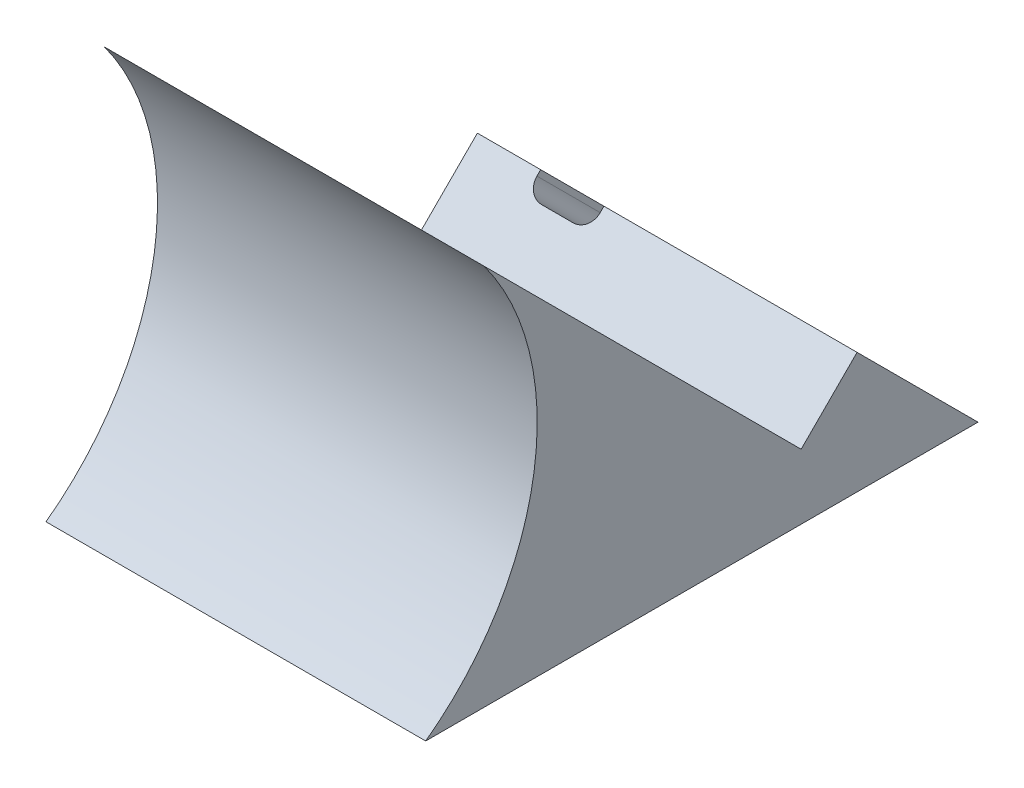
ISO-10303-21;
HEADER;
FILE_DESCRIPTION(('STEP AP214'),'2;1');
FILE_NAME('part.step','',(''),(''),'','','');
FILE_SCHEMA(('AUTOMOTIVE_DESIGN { 1 0 10303 214 1 1 1 1 }'));
ENDSEC;
DATA;
#1=APPLICATION_CONTEXT('core data for automotive mechanical design processes');
#2=APPLICATION_PROTOCOL_DEFINITION('international standard','automotive_design',2000,#1);
#3=PRODUCT_CONTEXT('',#1,'mechanical');
#4=PRODUCT('Part','Part','',(#3));
#5=PRODUCT_RELATED_PRODUCT_CATEGORY('part','',(#4));
#6=PRODUCT_DEFINITION_FORMATION('','',#4);
#7=PRODUCT_DEFINITION_CONTEXT('part definition',#1,'design');
#8=PRODUCT_DEFINITION('design','',#6,#7);
#9=PRODUCT_DEFINITION_SHAPE('','',#8);
#10=(LENGTH_UNIT() NAMED_UNIT(*) SI_UNIT(.MILLI.,.METRE.));
#11=(NAMED_UNIT(*) PLANE_ANGLE_UNIT() SI_UNIT($,.RADIAN.));
#12=(NAMED_UNIT(*) SI_UNIT($,.STERADIAN.) SOLID_ANGLE_UNIT());
#13=UNCERTAINTY_MEASURE_WITH_UNIT(LENGTH_MEASURE(1.E-05),#10,'distance_accuracy_value','');
#14=(GEOMETRIC_REPRESENTATION_CONTEXT(3) GLOBAL_UNCERTAINTY_ASSIGNED_CONTEXT((#13)) GLOBAL_UNIT_ASSIGNED_CONTEXT((#10,
#11,#12)) REPRESENTATION_CONTEXT('',''));
#15=CARTESIAN_POINT('',(0.,0.,0.));
#16=DIRECTION('',(0.,0.,1.));
#17=DIRECTION('',(1.,0.,0.));
#18=AXIS2_PLACEMENT_3D('',#15,#16,#17);
#19=CARTESIAN_POINT('',(72.,15.,-15.));
#20=DIRECTION('',(0.,-0.707106781186548,0.707106781186547));
#21=DIRECTION('',(0.,-0.707106781186547,-0.707106781186548));
#22=AXIS2_PLACEMENT_3D('',#19,#20,#21);
#23=PLANE('',#22);
#24=DIRECTION('',(0.,0.707106781186547,0.707106781186548));
#25=VECTOR('',#24,1.);
#26=CARTESIAN_POINT('',(0.,15.,-15.));
#27=LINE('',#26,#25);
#28=CARTESIAN_POINT('',(0.,12.3223304703363,-17.6776695296637));
#29=VERTEX_POINT('',#28);
#30=CARTESIAN_POINT('',(0.,72.4264068711928,42.4264068711928));
#31=VERTEX_POINT('',#30);
#32=EDGE_CURVE('E129',#29,#31,#27,.T.);
#33=ORIENTED_EDGE('',*,*,#32,.T.);
#34=DIRECTION('',(-1.,0.,0.));
#35=VECTOR('',#34,1.);
#36=CARTESIAN_POINT('',(72.,72.4264068711928,42.4264068711928));
#37=LINE('',#36,#35);
#38=CARTESIAN_POINT('',(72.,72.4264068711928,42.4264068711928));
#39=VERTEX_POINT('',#38);
#40=EDGE_CURVE('E187',#39,#31,#37,.T.);
#41=ORIENTED_EDGE('',*,*,#40,.F.);
#42=DIRECTION('',(0.,0.707106781186547,0.707106781186548));
#43=VECTOR('',#42,1.);
#44=CARTESIAN_POINT('',(72.,15.,-15.));
#45=LINE('',#44,#43);
#46=CARTESIAN_POINT('',(72.,12.3223304703363,-17.6776695296637));
#47=VERTEX_POINT('',#46);
#48=EDGE_CURVE('E146',#47,#39,#45,.T.);
#49=ORIENTED_EDGE('',*,*,#48,.F.);
#50=DIRECTION('',(1.,0.,0.));
#51=VECTOR('',#50,1.);
#52=CARTESIAN_POINT('',(0.,12.3223304703363,-17.6776695296637));
#53=LINE('',#52,#51);
#54=EDGE_CURVE('E144',#29,#47,#53,.T.);
#55=ORIENTED_EDGE('',*,*,#54,.F.);
#56=EDGE_LOOP('',(#33,#41,#49,#55));
#57=FACE_BOUND('',#56,.T.);
#58=ADVANCED_FACE('F35',(#57),#23,.F.);
#59=CARTESIAN_POINT('',(72.,41.7565544214539,84.1829612926468));
#60=DIRECTION('',(-1.,0.,0.));
#61=DIRECTION('',(0.,0.,1.));
#62=AXIS2_PLACEMENT_3D('',#59,#60,#61);
#63=CYLINDRICAL_SURFACE('',#62,51.8097450914459);
#64=CARTESIAN_POINT('',(0.,41.7565544214539,84.1829612926468));
#65=DIRECTION('',(1.,0.,0.));
#66=DIRECTION('',(0.,0.,-1.));
#67=AXIS2_PLACEMENT_3D('',#64,#65,#66);
#68=CIRCLE('',#67,51.8097450914459);
#69=CARTESIAN_POINT('',(0.,0.,53.5131088429079));
#70=VERTEX_POINT('',#69);
#71=EDGE_CURVE('E137',#31,#70,#68,.F.);
#72=ORIENTED_EDGE('',*,*,#71,.T.);
#73=DIRECTION('',(-1.,0.,0.));
#74=VECTOR('',#73,1.);
#75=CARTESIAN_POINT('',(72.,0.,53.5131088429079));
#76=LINE('',#75,#74);
#77=CARTESIAN_POINT('',(72.,0.,53.5131088429079));
#78=VERTEX_POINT('',#77);
#79=EDGE_CURVE('E185',#78,#70,#76,.T.);
#80=ORIENTED_EDGE('',*,*,#79,.F.);
#81=CARTESIAN_POINT('',(72.,41.7565544214539,84.1829612926468));
#82=DIRECTION('',(1.,0.,0.));
#83=DIRECTION('',(0.,0.,-1.));
#84=AXIS2_PLACEMENT_3D('',#81,#82,#83);
#85=CIRCLE('',#84,51.8097450914459);
#86=EDGE_CURVE('E170',#39,#78,#85,.F.);
#87=ORIENTED_EDGE('',*,*,#86,.F.);
#88=ORIENTED_EDGE('',*,*,#40,.T.);
#89=EDGE_LOOP('',(#72,#80,#87,#88));
#90=FACE_BOUND('',#89,.T.);
#91=ADVANCED_FACE('F265',(#90),#63,.F.);
#92=CARTESIAN_POINT('',(72.,0.,0.));
#93=DIRECTION('',(0.,-1.,0.));
#94=DIRECTION('',(0.,0.,-1.));
#95=AXIS2_PLACEMENT_3D('',#92,#93,#94);
#96=PLANE('',#95);
#97=DIRECTION('',(1.,0.,0.));
#98=VECTOR('',#97,1.);
#99=CARTESIAN_POINT('',(72.,0.,-45.581687127251));
#100=LINE('',#99,#98);
#101=CARTESIAN_POINT('',(14.6726183047219,0.,-45.581687127251));
#102=VERTEX_POINT('',#101);
#103=CARTESIAN_POINT('',(21.3273816952781,0.,-45.581687127251));
#104=VERTEX_POINT('',#103);
#105=EDGE_CURVE('E155',#102,#104,#100,.T.);
#106=ORIENTED_EDGE('',*,*,#105,.F.);
#107=CARTESIAN_POINT('',(15.,0.,-49.7989898732243));
#108=DIRECTION('',(0.,-1.,0.));
#109=DIRECTION('',(0.,0.,-1.));
#110=AXIS2_PLACEMENT_3D('',#107,#108,#109);
#111=ELLIPSE('',#110,4.24264068711934,3.);
#112=CARTESIAN_POINT('',(15.,0.,-45.556349186105));
#113=VERTEX_POINT('',#112);
#114=EDGE_CURVE('E11',#102,#113,#111,.F.);
#115=ORIENTED_EDGE('',*,*,#114,.T.);
#116=DIRECTION('',(-1.,0.,0.));
#117=VECTOR('',#116,1.);
#118=CARTESIAN_POINT('',(72.,0.,-45.556349186105));
#119=LINE('',#118,#117);
#120=CARTESIAN_POINT('',(21.,0.,-45.556349186105));
#121=VERTEX_POINT('',#120);
#122=EDGE_CURVE('E240',#121,#113,#119,.T.);
#123=ORIENTED_EDGE('',*,*,#122,.F.);
#124=CARTESIAN_POINT('',(21.,0.,-49.7989898732243));
#125=DIRECTION('',(0.,-1.,0.));
#126=DIRECTION('',(0.,0.,1.));
#127=AXIS2_PLACEMENT_3D('',#124,#125,#126);
#128=ELLIPSE('',#127,4.24264068711934,3.);
#129=EDGE_CURVE('E219',#121,#104,#128,.F.);
#130=ORIENTED_EDGE('',*,*,#129,.T.);
#131=EDGE_LOOP('',(#106,#115,#123,#130));
#132=FACE_BOUND('',#131,.T.);
#133=DIRECTION('',(0.,0.,1.));
#134=VECTOR('',#133,1.);
#135=CARTESIAN_POINT('',(0.,0.,0.));
#136=LINE('',#135,#134);
#137=CARTESIAN_POINT('',(0.,0.,-51.2132034355974));
#138=VERTEX_POINT('',#137);
#139=EDGE_CURVE('E180',#138,#70,#136,.T.);
#140=ORIENTED_EDGE('',*,*,#139,.F.);
#141=DIRECTION('',(-1.,0.,0.));
#142=VECTOR('',#141,1.);
#143=CARTESIAN_POINT('',(72.,0.,-51.2132034355974));
#144=LINE('',#143,#142);
#145=CARTESIAN_POINT('',(72.,0.,-51.2132034355974));
#146=VERTEX_POINT('',#145);
#147=EDGE_CURVE('E177',#146,#138,#144,.T.);
#148=ORIENTED_EDGE('',*,*,#147,.F.);
#149=DIRECTION('',(0.,0.,1.));
#150=VECTOR('',#149,1.);
#151=CARTESIAN_POINT('',(72.,0.,0.));
#152=LINE('',#151,#150);
#153=EDGE_CURVE('E173',#146,#78,#152,.T.);
#154=ORIENTED_EDGE('',*,*,#153,.T.);
#155=ORIENTED_EDGE('',*,*,#79,.T.);
#156=EDGE_LOOP('',(#140,#148,#154,#155));
#157=FACE_BOUND('',#156,.T.);
#158=ADVANCED_FACE('F237',(#132,#157),#96,.T.);
#159=CARTESIAN_POINT('',(72.,25.6066017177987,-25.6066017177981));
#160=DIRECTION('',(0.,0.707106781186556,-0.707106781186539));
#161=DIRECTION('',(0.,0.707106781186539,0.707106781186556));
#162=AXIS2_PLACEMENT_3D('',#159,#160,#161);
#163=PLANE('',#162);
#164=DIRECTION('',(0.,0.707106781186539,0.707106781186556));
#165=VECTOR('',#164,1.);
#166=CARTESIAN_POINT('',(12.,40.6066017177983,-10.6066017177981));
#167=LINE('',#166,#165);
#168=CARTESIAN_POINT('',(12.,0.553016454376275,-50.6601869812211));
#169=VERTEX_POINT('',#168);
#170=CARTESIAN_POINT('',(12.,22.9289321881349,-28.284271247462));
#171=VERTEX_POINT('',#170);
#172=EDGE_CURVE('E165',#169,#171,#167,.T.);
#173=ORIENTED_EDGE('',*,*,#172,.F.);
#174=DIRECTION('',(1.,0.,0.));
#175=VECTOR('',#174,1.);
#176=CARTESIAN_POINT('',(24.,0.553016454376276,-50.6601869812211));
#177=LINE('',#176,#175);
#178=CARTESIAN_POINT('',(24.,0.553016454376269,-50.6601869812211));
#179=VERTEX_POINT('',#178);
#180=EDGE_CURVE('E195',#169,#179,#177,.T.);
#181=ORIENTED_EDGE('',*,*,#180,.T.);
#182=DIRECTION('',(0.,-0.707106781186539,-0.707106781186556));
#183=VECTOR('',#182,1.);
#184=CARTESIAN_POINT('',(24.,40.6066017177983,-10.6066017177981));
#185=LINE('',#184,#183);
#186=CARTESIAN_POINT('',(24.,22.9289321881349,-28.284271247462));
#187=VERTEX_POINT('',#186);
#188=EDGE_CURVE('E141',#187,#179,#185,.T.);
#189=ORIENTED_EDGE('',*,*,#188,.F.);
#190=DIRECTION('',(1.,0.,0.));
#191=VECTOR('',#190,1.);
#192=CARTESIAN_POINT('',(0.,22.9289321881349,-28.284271247462));
#193=LINE('',#192,#191);
#194=CARTESIAN_POINT('',(72.,22.9289321881349,-28.284271247462));
#195=VERTEX_POINT('',#194);
#196=EDGE_CURVE('E148',#187,#195,#193,.T.);
#197=ORIENTED_EDGE('',*,*,#196,.T.);
#198=DIRECTION('',(0.,-0.707106781186539,-0.707106781186556));
#199=VECTOR('',#198,1.);
#200=CARTESIAN_POINT('',(72.,25.6066017177987,-25.6066017177981));
#201=LINE('',#200,#199);
#202=EDGE_CURVE('E176',#195,#146,#201,.T.);
#203=ORIENTED_EDGE('',*,*,#202,.T.);
#204=ORIENTED_EDGE('',*,*,#147,.T.);
#205=DIRECTION('',(0.,-0.707106781186539,-0.707106781186556));
#206=VECTOR('',#205,1.);
#207=CARTESIAN_POINT('',(0.,25.6066017177987,-25.6066017177981));
#208=LINE('',#207,#206);
#209=CARTESIAN_POINT('',(0.,22.9289321881349,-28.284271247462));
#210=VERTEX_POINT('',#209);
#211=EDGE_CURVE('E171',#210,#138,#208,.T.);
#212=ORIENTED_EDGE('',*,*,#211,.F.);
#213=EDGE_CURVE('E152',#210,#171,#193,.T.);
#214=ORIENTED_EDGE('',*,*,#213,.T.);
#215=EDGE_LOOP('',(#173,#181,#189,#197,#203,#204,#212,#214));
#216=FACE_BOUND('',#215,.T.);
#217=ADVANCED_FACE('F258',(#216),#163,.T.);
#218=CARTESIAN_POINT('',(72.,0.,0.));
#219=DIRECTION('',(1.,0.,0.));
#220=DIRECTION('',(0.,0.,-1.));
#221=AXIS2_PLACEMENT_3D('',#218,#219,#220);
#222=PLANE('',#221);
#223=DIRECTION('',(0.,0.707106781186556,-0.707106781186539));
#224=VECTOR('',#223,1.);
#225=CARTESIAN_POINT('',(72.,12.3223304703363,-17.6776695296637));
#226=LINE('',#225,#224);
#227=EDGE_CURVE('E153',#47,#195,#226,.T.);
#228=ORIENTED_EDGE('',*,*,#227,.F.);
#229=ORIENTED_EDGE('',*,*,#48,.T.);
#230=ORIENTED_EDGE('',*,*,#86,.T.);
#231=ORIENTED_EDGE('',*,*,#153,.F.);
#232=ORIENTED_EDGE('',*,*,#202,.F.);
#233=EDGE_LOOP('',(#228,#229,#230,#231,#232));
#234=FACE_BOUND('',#233,.T.);
#235=ADVANCED_FACE('F267',(#234),#222,.T.);
#236=CARTESIAN_POINT('',(0.,0.,0.));
#237=DIRECTION('',(1.,0.,0.));
#238=DIRECTION('',(0.,0.,-1.));
#239=AXIS2_PLACEMENT_3D('',#236,#237,#238);
#240=PLANE('',#239);
#241=ORIENTED_EDGE('',*,*,#32,.F.);
#242=DIRECTION('',(0.,0.707106781186556,-0.707106781186539));
#243=VECTOR('',#242,1.);
#244=CARTESIAN_POINT('',(0.,12.3223304703363,-17.6776695296637));
#245=LINE('',#244,#243);
#246=EDGE_CURVE('E133',#29,#210,#245,.T.);
#247=ORIENTED_EDGE('',*,*,#246,.T.);
#248=ORIENTED_EDGE('',*,*,#211,.T.);
#249=ORIENTED_EDGE('',*,*,#139,.T.);
#250=ORIENTED_EDGE('',*,*,#71,.F.);
#251=EDGE_LOOP('',(#241,#247,#248,#249,#250));
#252=FACE_BOUND('',#251,.T.);
#253=ADVANCED_FACE('F131',(#252),#240,.F.);
#254=CARTESIAN_POINT('',(12.,37.7781745930521,-7.77817459305193));
#255=DIRECTION('',(-1.,0.,0.));
#256=DIRECTION('',(0.,0.,1.));
#257=AXIS2_PLACEMENT_3D('',#254,#255,#256);
#258=PLANE('',#257);
#259=DIRECTION('',(0.,-0.707106781186556,0.707106781186539));
#260=VECTOR('',#259,1.);
#261=CARTESIAN_POINT('',(12.,20.1005050633886,-25.4558441227158));
#262=LINE('',#261,#260);
#263=CARTESIAN_POINT('',(12.,22.2218254069483,-27.5771644662755));
#264=VERTEX_POINT('',#263);
#265=EDGE_CURVE('E163',#171,#264,#262,.T.);
#266=ORIENTED_EDGE('',*,*,#265,.T.);
#267=DIRECTION('',(0.,0.707106781186539,0.707106781186556));
#268=VECTOR('',#267,1.);
#269=CARTESIAN_POINT('',(12.,2.12132034355966,-47.6776695296646));
#270=LINE('',#269,#268);
#271=CARTESIAN_POINT('',(12.,0.553016454376263,-49.245973418848));
#272=VERTEX_POINT('',#271);
#273=EDGE_CURVE('E217',#264,#272,#270,.F.);
#274=ORIENTED_EDGE('',*,*,#273,.T.);
#275=DIRECTION('',(0.,0.,-1.));
#276=VECTOR('',#275,1.);
#277=CARTESIAN_POINT('',(12.,0.553016454375818,-7.77817459305233));
#278=LINE('',#277,#276);
#279=EDGE_CURVE('E198',#272,#169,#278,.T.);
#280=ORIENTED_EDGE('',*,*,#279,.T.);
#281=ORIENTED_EDGE('',*,*,#172,.T.);
#282=EDGE_LOOP('',(#266,#274,#280,#281));
#283=FACE_BOUND('',#282,.T.);
#284=ADVANCED_FACE('F250',(#283),#258,.F.);
#285=CARTESIAN_POINT('',(24.,37.7781745930521,-7.77817459305193));
#286=DIRECTION('',(1.,0.,0.));
#287=DIRECTION('',(0.,0.,-1.));
#288=AXIS2_PLACEMENT_3D('',#285,#286,#287);
#289=PLANE('',#288);
#290=DIRECTION('',(0.,0.,1.));
#291=VECTOR('',#290,1.);
#292=CARTESIAN_POINT('',(24.,0.553016454375818,-7.77817459305233));
#293=LINE('',#292,#291);
#294=CARTESIAN_POINT('',(24.,0.553016454376263,-49.2459734188481));
#295=VERTEX_POINT('',#294);
#296=EDGE_CURVE('E200',#179,#295,#293,.T.);
#297=ORIENTED_EDGE('',*,*,#296,.T.);
#298=DIRECTION('',(0.,-0.707106781186539,-0.707106781186556));
#299=VECTOR('',#298,1.);
#300=CARTESIAN_POINT('',(24.,22.2218254069483,-27.5771644662755));
#301=LINE('',#300,#299);
#302=CARTESIAN_POINT('',(24.,22.2218254069483,-27.5771644662755));
#303=VERTEX_POINT('',#302);
#304=EDGE_CURVE('E57',#295,#303,#301,.F.);
#305=ORIENTED_EDGE('',*,*,#304,.T.);
#306=DIRECTION('',(0.,0.707106781186556,-0.707106781186539));
#307=VECTOR('',#306,1.);
#308=CARTESIAN_POINT('',(24.,20.1005050633886,-25.4558441227158));
#309=LINE('',#308,#307);
#310=EDGE_CURVE('E160',#303,#187,#309,.T.);
#311=ORIENTED_EDGE('',*,*,#310,.T.);
#312=ORIENTED_EDGE('',*,*,#188,.T.);
#313=EDGE_LOOP('',(#297,#305,#311,#312));
#314=FACE_BOUND('',#313,.T.);
#315=ADVANCED_FACE('F330',(#314),#289,.F.);
#316=CARTESIAN_POINT('',(0.,22.7781745930525,-22.7781745930519));
#317=DIRECTION('',(0.,-0.707106781186556,0.707106781186539));
#318=DIRECTION('',(0.,-0.707106781186539,-0.707106781186556));
#319=AXIS2_PLACEMENT_3D('',#316,#317,#318);
#320=PLANE('',#319);
#321=DIRECTION('',(1.,0.,0.));
#322=VECTOR('',#321,1.);
#323=CARTESIAN_POINT('',(0.,20.1005050633886,-25.4558441227158));
#324=LINE('',#323,#322);
#325=CARTESIAN_POINT('',(15.,20.1005050633886,-25.4558441227158));
#326=VERTEX_POINT('',#325);
#327=CARTESIAN_POINT('',(21.,20.1005050633886,-25.4558441227158));
#328=VERTEX_POINT('',#327);
#329=EDGE_CURVE('E189',#326,#328,#324,.T.);
#330=ORIENTED_EDGE('',*,*,#329,.T.);
#331=DIRECTION('',(0.,-0.707106781186539,-0.707106781186556));
#332=VECTOR('',#331,1.);
#333=CARTESIAN_POINT('',(21.,0.,-45.556349186105));
#334=LINE('',#333,#332);
#335=EDGE_CURVE('E205',#328,#121,#334,.T.);
#336=ORIENTED_EDGE('',*,*,#335,.T.);
#337=ORIENTED_EDGE('',*,*,#122,.T.);
#338=DIRECTION('',(0.,0.707106781186539,0.707106781186556));
#339=VECTOR('',#338,1.);
#340=CARTESIAN_POINT('',(15.,20.1005050633886,-25.4558441227158));
#341=LINE('',#340,#339);
#342=EDGE_CURVE('E202',#113,#326,#341,.T.);
#343=ORIENTED_EDGE('',*,*,#342,.T.);
#344=EDGE_LOOP('',(#330,#336,#337,#343));
#345=FACE_BOUND('',#344,.T.);
#346=ADVANCED_FACE('F227',(#345),#320,.F.);
#347=CARTESIAN_POINT('',(0.,12.3223304703363,-17.6776695296637));
#348=DIRECTION('',(0.,-0.707106781186539,-0.707106781186556));
#349=DIRECTION('',(0.,0.707106781186556,-0.707106781186539));
#350=AXIS2_PLACEMENT_3D('',#347,#348,#349);
#351=PLANE('',#350);
#352=ORIENTED_EDGE('',*,*,#213,.F.);
#353=ORIENTED_EDGE('',*,*,#246,.F.);
#354=ORIENTED_EDGE('',*,*,#54,.T.);
#355=ORIENTED_EDGE('',*,*,#227,.T.);
#356=ORIENTED_EDGE('',*,*,#196,.F.);
#357=ORIENTED_EDGE('',*,*,#310,.F.);
#358=CARTESIAN_POINT('',(21.,22.2218254069483,-27.5771644662755));
#359=DIRECTION('',(0.,-0.707106781186539,-0.707106781186556));
#360=DIRECTION('',(0.,0.707106781186556,-0.707106781186539));
#361=AXIS2_PLACEMENT_3D('',#358,#359,#360);
#362=CIRCLE('',#361,3.);
#363=EDGE_CURVE('E221',#303,#328,#362,.T.);
#364=ORIENTED_EDGE('',*,*,#363,.T.);
#365=ORIENTED_EDGE('',*,*,#329,.F.);
#366=CARTESIAN_POINT('',(15.,22.2218254069483,-27.5771644662755));
#367=DIRECTION('',(0.,-0.707106781186539,-0.707106781186556));
#368=DIRECTION('',(0.,0.707106781186556,-0.707106781186539));
#369=AXIS2_PLACEMENT_3D('',#366,#367,#368);
#370=CIRCLE('',#369,3.);
#371=EDGE_CURVE('E43',#326,#264,#370,.T.);
#372=ORIENTED_EDGE('',*,*,#371,.T.);
#373=ORIENTED_EDGE('',*,*,#265,.F.);
#374=EDGE_LOOP('',(#352,#353,#354,#355,#356,#357,#364,#365,#372,#373));
#375=FACE_BOUND('',#374,.T.);
#376=ADVANCED_FACE('F150',(#375),#351,.F.);
#377=CARTESIAN_POINT('',(24.,-12.7553106591105,-32.8263764681408));
#378=DIRECTION('',(0.,-0.707106781186539,-0.707106781186556));
#379=DIRECTION('',(0.,0.707106781186556,-0.707106781186539));
#380=AXIS2_PLACEMENT_3D('',#377,#378,#379);
#381=PLANE('',#380);
#382=ORIENTED_EDGE('',*,*,#105,.T.);
#383=CARTESIAN_POINT('',(21.,2.10865137298666,-47.6903385002376));
#384=DIRECTION('',(0.,-0.707106781186539,-0.707106781186556));
#385=DIRECTION('',(0.,0.707106781186556,-0.707106781186539));
#386=AXIS2_PLACEMENT_3D('',#383,#384,#385);
#387=CIRCLE('',#386,3.);
#388=CARTESIAN_POINT('',(23.0396078054371,0.553016454376229,-46.1347035816272));
#389=VERTEX_POINT('',#388);
#390=EDGE_CURVE('E210',#104,#389,#387,.F.);
#391=ORIENTED_EDGE('',*,*,#390,.T.);
#392=DIRECTION('',(-1.,0.,0.));
#393=VECTOR('',#392,1.);
#394=CARTESIAN_POINT('',(12.,0.553016454376229,-46.1347035816272));
#395=LINE('',#394,#393);
#396=CARTESIAN_POINT('',(12.9603921945629,0.553016454376232,-46.1347035816272));
#397=VERTEX_POINT('',#396);
#398=EDGE_CURVE('E192',#389,#397,#395,.T.);
#399=ORIENTED_EDGE('',*,*,#398,.T.);
#400=CARTESIAN_POINT('',(15.,2.10865137298666,-47.6903385002376));
#401=DIRECTION('',(0.,-0.707106781186539,-0.707106781186556));
#402=DIRECTION('',(0.,0.707106781186556,-0.707106781186539));
#403=AXIS2_PLACEMENT_3D('',#400,#401,#402);
#404=CIRCLE('',#403,3.);
#405=EDGE_CURVE('E208',#397,#102,#404,.F.);
#406=ORIENTED_EDGE('',*,*,#405,.T.);
#407=EDGE_LOOP('',(#382,#391,#399,#406));
#408=FACE_BOUND('',#407,.T.);
#409=ADVANCED_FACE('F242',(#408),#381,.F.);
#410=CARTESIAN_POINT('',(24.,0.553016454376227,-46.1347035816272));
#411=DIRECTION('',(0.,1.,0.));
#412=DIRECTION('',(1.,0.,0.));
#413=AXIS2_PLACEMENT_3D('',#410,#411,#412);
#414=PLANE('',#413);
#415=ORIENTED_EDGE('',*,*,#398,.F.);
#416=CARTESIAN_POINT('',(21.,0.553016454376259,-49.245973418848));
#417=DIRECTION('',(0.,1.,0.));
#418=DIRECTION('',(0.,0.,1.));
#419=AXIS2_PLACEMENT_3D('',#416,#417,#418);
#420=ELLIPSE('',#419,4.24264068711929,3.);
#421=EDGE_CURVE('E214',#389,#295,#420,.T.);
#422=ORIENTED_EDGE('',*,*,#421,.T.);
#423=ORIENTED_EDGE('',*,*,#296,.F.);
#424=ORIENTED_EDGE('',*,*,#180,.F.);
#425=ORIENTED_EDGE('',*,*,#279,.F.);
#426=CARTESIAN_POINT('',(15.,0.553016454376259,-49.245973418848));
#427=DIRECTION('',(0.,1.,0.));
#428=DIRECTION('',(0.,0.,-1.));
#429=AXIS2_PLACEMENT_3D('',#426,#427,#428);
#430=ELLIPSE('',#429,4.24264068711929,3.);
#431=EDGE_CURVE('E212',#272,#397,#430,.T.);
#432=ORIENTED_EDGE('',*,*,#431,.T.);
#433=EDGE_LOOP('',(#415,#422,#423,#424,#425,#432));
#434=FACE_BOUND('',#433,.T.);
#435=ADVANCED_FACE('F254',(#434),#414,.T.);
#436=CARTESIAN_POINT('',(21.,24.8994949366122,-24.8994949366116));
#437=DIRECTION('',(0.,0.707106781186539,0.707106781186556));
#438=DIRECTION('',(0.,-0.707106781186556,0.707106781186539));
#439=AXIS2_PLACEMENT_3D('',#436,#437,#438);
#440=CYLINDRICAL_SURFACE('',#439,3.);
#441=ORIENTED_EDGE('',*,*,#363,.F.);
#442=ORIENTED_EDGE('',*,*,#304,.F.);
#443=ORIENTED_EDGE('',*,*,#421,.F.);
#444=ORIENTED_EDGE('',*,*,#390,.F.);
#445=ORIENTED_EDGE('',*,*,#129,.F.);
#446=ORIENTED_EDGE('',*,*,#335,.F.);
#447=EDGE_LOOP('',(#441,#442,#443,#444,#445,#446));
#448=FACE_BOUND('',#447,.T.);
#449=ADVANCED_FACE('F231',(#448),#440,.F.);
#450=CARTESIAN_POINT('',(15.,24.8994949366122,-24.8994949366116));
#451=DIRECTION('',(0.,-0.707106781186539,-0.707106781186556));
#452=DIRECTION('',(0.,0.707106781186556,-0.707106781186539));
#453=AXIS2_PLACEMENT_3D('',#450,#451,#452);
#454=CYLINDRICAL_SURFACE('',#453,3.);
#455=ORIENTED_EDGE('',*,*,#431,.F.);
#456=ORIENTED_EDGE('',*,*,#273,.F.);
#457=ORIENTED_EDGE('',*,*,#371,.F.);
#458=ORIENTED_EDGE('',*,*,#342,.F.);
#459=ORIENTED_EDGE('',*,*,#114,.F.);
#460=ORIENTED_EDGE('',*,*,#405,.F.);
#461=EDGE_LOOP('',(#455,#456,#457,#458,#459,#460));
#462=FACE_BOUND('',#461,.T.);
#463=ADVANCED_FACE('F37',(#462),#454,.F.);
#464=CLOSED_SHELL('',(#58,#91,#158,#217,#235,#253,#284,#315,#346,#376,#409,#435,#449,#463));
#465=MANIFOLD_SOLID_BREP('B2',#464);
#466=ADVANCED_BREP_SHAPE_REPRESENTATION('',(#18,#465),#14);
#467=SHAPE_DEFINITION_REPRESENTATION(#9,#466);
ENDSEC;
END-ISO-10303-21;
